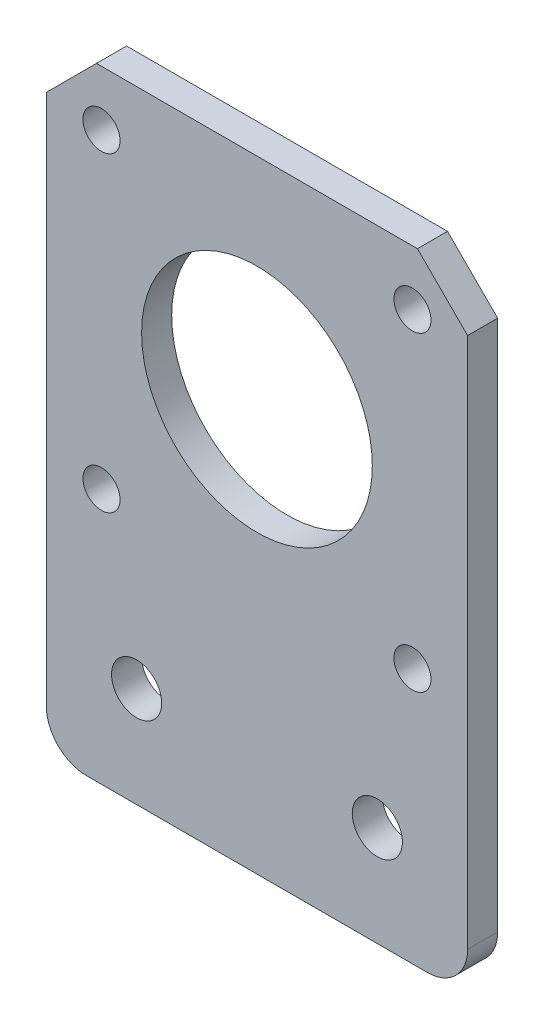
ISO-10303-21;
HEADER;
FILE_DESCRIPTION(('STEP AP214'),'2;1');
FILE_NAME('part.step','',(''),(''),'','','');
FILE_SCHEMA(('AUTOMOTIVE_DESIGN { 1 0 10303 214 1 1 1 1 }'));
ENDSEC;
DATA;
#1=APPLICATION_CONTEXT('core data for automotive mechanical design processes');
#2=APPLICATION_PROTOCOL_DEFINITION('international standard','automotive_design',2000,#1);
#3=PRODUCT_CONTEXT('',#1,'mechanical');
#4=PRODUCT('Part','Part','',(#3));
#5=PRODUCT_RELATED_PRODUCT_CATEGORY('part','',(#4));
#6=PRODUCT_DEFINITION_FORMATION('','',#4);
#7=PRODUCT_DEFINITION_CONTEXT('part definition',#1,'design');
#8=PRODUCT_DEFINITION('design','',#6,#7);
#9=PRODUCT_DEFINITION_SHAPE('','',#8);
#10=(LENGTH_UNIT() NAMED_UNIT(*) SI_UNIT(.MILLI.,.METRE.));
#11=(NAMED_UNIT(*) PLANE_ANGLE_UNIT() SI_UNIT($,.RADIAN.));
#12=(NAMED_UNIT(*) SI_UNIT($,.STERADIAN.) SOLID_ANGLE_UNIT());
#13=UNCERTAINTY_MEASURE_WITH_UNIT(LENGTH_MEASURE(1.E-05),#10,'distance_accuracy_value','');
#14=(GEOMETRIC_REPRESENTATION_CONTEXT(3) GLOBAL_UNCERTAINTY_ASSIGNED_CONTEXT((#13)) GLOBAL_UNIT_ASSIGNED_CONTEXT((#10,
#11,#12)) REPRESENTATION_CONTEXT('',''));
#15=CARTESIAN_POINT('',(0.,0.,0.));
#16=DIRECTION('',(0.,0.,1.));
#17=DIRECTION('',(1.,0.,0.));
#18=AXIS2_PLACEMENT_3D('',#15,#16,#17);
#19=CARTESIAN_POINT('',(0.,0.,3.));
#20=DIRECTION('',(0.,0.,1.));
#21=DIRECTION('',(1.,0.,0.));
#22=AXIS2_PLACEMENT_3D('',#19,#20,#21);
#23=PLANE('',#22);
#24=CARTESIAN_POINT('',(12.,-31.,3.));
#25=DIRECTION('',(0.,0.,1.));
#26=DIRECTION('',(-1.,0.,0.));
#27=AXIS2_PLACEMENT_3D('',#24,#25,#26);
#28=CIRCLE('',#27,2.5);
#29=CARTESIAN_POINT('',(9.49999999999999,-31.,3.));
#30=VERTEX_POINT('',#29);
#31=EDGE_CURVE('E288',#30,#30,#28,.T.);
#32=ORIENTED_EDGE('',*,*,#31,.F.);
#33=EDGE_LOOP('',(#32));
#34=FACE_BOUND('',#33,.T.);
#35=CARTESIAN_POINT('',(-15.5,-15.5,3.));
#36=DIRECTION('',(0.,0.,1.));
#37=DIRECTION('',(-1.,0.,0.));
#38=AXIS2_PLACEMENT_3D('',#35,#36,#37);
#39=CIRCLE('',#38,1.84974093264249);
#40=CARTESIAN_POINT('',(-17.3497409326425,-15.5,3.));
#41=VERTEX_POINT('',#40);
#42=EDGE_CURVE('E296',#41,#41,#39,.T.);
#43=ORIENTED_EDGE('',*,*,#42,.F.);
#44=EDGE_LOOP('',(#43));
#45=FACE_BOUND('',#44,.T.);
#46=CARTESIAN_POINT('',(15.5,15.5,3.));
#47=DIRECTION('',(0.,0.,1.));
#48=DIRECTION('',(-1.,0.,0.));
#49=AXIS2_PLACEMENT_3D('',#46,#47,#48);
#50=CIRCLE('',#49,1.84974093264249);
#51=CARTESIAN_POINT('',(13.6502590673575,15.5,3.));
#52=VERTEX_POINT('',#51);
#53=EDGE_CURVE('E234',#52,#52,#50,.T.);
#54=ORIENTED_EDGE('',*,*,#53,.F.);
#55=EDGE_LOOP('',(#54));
#56=FACE_BOUND('',#55,.T.);
#57=DIRECTION('',(0.,1.,0.));
#58=VECTOR('',#57,1.);
#59=CARTESIAN_POINT('',(21.,-21.,3.));
#60=LINE('',#59,#58);
#61=CARTESIAN_POINT('',(21.,-37.,3.));
#62=VERTEX_POINT('',#61);
#63=CARTESIAN_POINT('',(21.,16.,3.));
#64=VERTEX_POINT('',#63);
#65=EDGE_CURVE('E115',#62,#64,#60,.T.);
#66=ORIENTED_EDGE('',*,*,#65,.T.);
#67=DIRECTION('',(0.707106781186546,-0.707106781186549,0.));
#68=VECTOR('',#67,1.);
#69=CARTESIAN_POINT('',(18.5,18.5,3.));
#70=LINE('',#69,#68);
#71=CARTESIAN_POINT('',(16.,21.,3.));
#72=VERTEX_POINT('',#71);
#73=EDGE_CURVE('E40',#64,#72,#70,.F.);
#74=ORIENTED_EDGE('',*,*,#73,.T.);
#75=DIRECTION('',(-1.,0.,0.));
#76=VECTOR('',#75,1.);
#77=CARTESIAN_POINT('',(-21.,21.,3.));
#78=LINE('',#77,#76);
#79=CARTESIAN_POINT('',(-16.,21.,3.));
#80=VERTEX_POINT('',#79);
#81=EDGE_CURVE('E116',#72,#80,#78,.T.);
#82=ORIENTED_EDGE('',*,*,#81,.T.);
#83=DIRECTION('',(0.707106781186549,0.707106781186546,0.));
#84=VECTOR('',#83,1.);
#85=CARTESIAN_POINT('',(-18.4999999999999,18.5,3.));
#86=LINE('',#85,#84);
#87=CARTESIAN_POINT('',(-21.,16.,3.));
#88=VERTEX_POINT('',#87);
#89=EDGE_CURVE('E47',#80,#88,#86,.F.);
#90=ORIENTED_EDGE('',*,*,#89,.T.);
#91=DIRECTION('',(0.,-1.,0.));
#92=VECTOR('',#91,1.);
#93=CARTESIAN_POINT('',(-21.,21.,3.));
#94=LINE('',#93,#92);
#95=CARTESIAN_POINT('',(-21.,-37.,3.));
#96=VERTEX_POINT('',#95);
#97=EDGE_CURVE('E126',#88,#96,#94,.T.);
#98=ORIENTED_EDGE('',*,*,#97,.T.);
#99=CARTESIAN_POINT('',(-17.,-37.,3.));
#100=DIRECTION('',(0.,0.,1.));
#101=DIRECTION('',(1.,0.,0.));
#102=AXIS2_PLACEMENT_3D('',#99,#100,#101);
#103=CIRCLE('',#102,4.);
#104=CARTESIAN_POINT('',(-17.,-41.,3.));
#105=VERTEX_POINT('',#104);
#106=EDGE_CURVE('E137',#96,#105,#103,.T.);
#107=ORIENTED_EDGE('',*,*,#106,.T.);
#108=DIRECTION('',(1.,0.,0.));
#109=VECTOR('',#108,1.);
#110=CARTESIAN_POINT('',(-21.,-41.,3.));
#111=LINE('',#110,#109);
#112=CARTESIAN_POINT('',(17.,-41.,3.));
#113=VERTEX_POINT('',#112);
#114=EDGE_CURVE('E254',#105,#113,#111,.T.);
#115=ORIENTED_EDGE('',*,*,#114,.T.);
#116=CARTESIAN_POINT('',(17.,-37.,3.));
#117=DIRECTION('',(0.,0.,1.));
#118=DIRECTION('',(1.,0.,0.));
#119=AXIS2_PLACEMENT_3D('',#116,#117,#118);
#120=CIRCLE('',#119,4.);
#121=EDGE_CURVE('E139',#113,#62,#120,.T.);
#122=ORIENTED_EDGE('',*,*,#121,.T.);
#123=EDGE_LOOP('',(#66,#74,#82,#90,#98,#107,#115,#122));
#124=FACE_BOUND('',#123,.T.);
#125=CARTESIAN_POINT('',(-15.5,15.5,3.));
#126=DIRECTION('',(0.,0.,1.));
#127=DIRECTION('',(1.,0.,0.));
#128=AXIS2_PLACEMENT_3D('',#125,#126,#127);
#129=CIRCLE('',#128,1.84974093264249);
#130=CARTESIAN_POINT('',(-13.6502590673575,15.5,3.));
#131=VERTEX_POINT('',#130);
#132=EDGE_CURVE('E248',#131,#131,#129,.T.);
#133=ORIENTED_EDGE('',*,*,#132,.F.);
#134=EDGE_LOOP('',(#133));
#135=FACE_BOUND('',#134,.T.);
#136=CARTESIAN_POINT('',(15.5,-15.5,3.));
#137=DIRECTION('',(0.,0.,1.));
#138=DIRECTION('',(1.,0.,0.));
#139=AXIS2_PLACEMENT_3D('',#136,#137,#138);
#140=CIRCLE('',#139,1.84974093264249);
#141=CARTESIAN_POINT('',(17.3497409326424,-15.5,3.));
#142=VERTEX_POINT('',#141);
#143=EDGE_CURVE('E239',#142,#142,#140,.T.);
#144=ORIENTED_EDGE('',*,*,#143,.F.);
#145=EDGE_LOOP('',(#144));
#146=FACE_BOUND('',#145,.T.);
#147=CARTESIAN_POINT('',(-12.,-31.,3.));
#148=DIRECTION('',(0.,0.,1.));
#149=DIRECTION('',(1.,0.,0.));
#150=AXIS2_PLACEMENT_3D('',#147,#148,#149);
#151=CIRCLE('',#150,2.5);
#152=CARTESIAN_POINT('',(-9.49999999999999,-31.,3.));
#153=VERTEX_POINT('',#152);
#154=EDGE_CURVE('E292',#153,#153,#151,.T.);
#155=ORIENTED_EDGE('',*,*,#154,.F.);
#156=EDGE_LOOP('',(#155));
#157=FACE_BOUND('',#156,.T.);
#158=CARTESIAN_POINT('',(0.,0.,3.));
#159=DIRECTION('',(0.,0.,1.));
#160=DIRECTION('',(1.,0.,0.));
#161=AXIS2_PLACEMENT_3D('',#158,#159,#160);
#162=CIRCLE('',#161,11.5);
#163=CARTESIAN_POINT('',(11.5,0.,3.));
#164=VERTEX_POINT('',#163);
#165=EDGE_CURVE('E284',#164,#164,#162,.T.);
#166=ORIENTED_EDGE('',*,*,#165,.F.);
#167=EDGE_LOOP('',(#166));
#168=FACE_BOUND('',#167,.T.);
#169=ADVANCED_FACE('F32',(#34,#45,#56,#124,#135,#146,#157,#168),#23,.T.);
#170=CARTESIAN_POINT('',(0.,0.,0.));
#171=DIRECTION('',(0.,0.,1.));
#172=DIRECTION('',(1.,0.,0.));
#173=AXIS2_PLACEMENT_3D('',#170,#171,#172);
#174=PLANE('',#173);
#175=DIRECTION('',(-1.,0.,0.));
#176=VECTOR('',#175,1.);
#177=CARTESIAN_POINT('',(-21.,21.,0.));
#178=LINE('',#177,#176);
#179=CARTESIAN_POINT('',(16.,21.,0.));
#180=VERTEX_POINT('',#179);
#181=CARTESIAN_POINT('',(-16.,21.,0.));
#182=VERTEX_POINT('',#181);
#183=EDGE_CURVE('E122',#180,#182,#178,.T.);
#184=ORIENTED_EDGE('',*,*,#183,.F.);
#185=DIRECTION('',(-0.707106781186546,0.707106781186549,0.));
#186=VECTOR('',#185,1.);
#187=CARTESIAN_POINT('',(16.,21.,0.));
#188=LINE('',#187,#186);
#189=CARTESIAN_POINT('',(21.,16.,0.));
#190=VERTEX_POINT('',#189);
#191=EDGE_CURVE('E121',#180,#190,#188,.F.);
#192=ORIENTED_EDGE('',*,*,#191,.T.);
#193=DIRECTION('',(0.,1.,0.));
#194=VECTOR('',#193,1.);
#195=CARTESIAN_POINT('',(21.,21.,0.));
#196=LINE('',#195,#194);
#197=CARTESIAN_POINT('',(21.,-37.,0.));
#198=VERTEX_POINT('',#197);
#199=EDGE_CURVE('E114',#198,#190,#196,.T.);
#200=ORIENTED_EDGE('',*,*,#199,.F.);
#201=CARTESIAN_POINT('',(17.,-37.,0.));
#202=DIRECTION('',(0.,0.,1.));
#203=DIRECTION('',(1.,0.,0.));
#204=AXIS2_PLACEMENT_3D('',#201,#202,#203);
#205=CIRCLE('',#204,4.);
#206=CARTESIAN_POINT('',(17.,-41.,0.));
#207=VERTEX_POINT('',#206);
#208=EDGE_CURVE('E100',#198,#207,#205,.F.);
#209=ORIENTED_EDGE('',*,*,#208,.T.);
#210=DIRECTION('',(1.,0.,0.));
#211=VECTOR('',#210,1.);
#212=CARTESIAN_POINT('',(-21.,-41.,0.));
#213=LINE('',#212,#211);
#214=CARTESIAN_POINT('',(-17.,-41.,0.));
#215=VERTEX_POINT('',#214);
#216=EDGE_CURVE('E123',#215,#207,#213,.T.);
#217=ORIENTED_EDGE('',*,*,#216,.F.);
#218=CARTESIAN_POINT('',(-17.,-37.,0.));
#219=DIRECTION('',(0.,0.,1.));
#220=DIRECTION('',(1.,0.,0.));
#221=AXIS2_PLACEMENT_3D('',#218,#219,#220);
#222=CIRCLE('',#221,4.);
#223=CARTESIAN_POINT('',(-21.,-37.,0.));
#224=VERTEX_POINT('',#223);
#225=EDGE_CURVE('E111',#215,#224,#222,.F.);
#226=ORIENTED_EDGE('',*,*,#225,.T.);
#227=DIRECTION('',(0.,-1.,0.));
#228=VECTOR('',#227,1.);
#229=CARTESIAN_POINT('',(-21.,-21.,0.));
#230=LINE('',#229,#228);
#231=CARTESIAN_POINT('',(-21.,16.,0.));
#232=VERTEX_POINT('',#231);
#233=EDGE_CURVE('E128',#232,#224,#230,.T.);
#234=ORIENTED_EDGE('',*,*,#233,.F.);
#235=DIRECTION('',(-0.707106781186549,-0.707106781186546,0.));
#236=VECTOR('',#235,1.);
#237=CARTESIAN_POINT('',(-21.,16.,0.));
#238=LINE('',#237,#236);
#239=EDGE_CURVE('E149',#232,#182,#238,.F.);
#240=ORIENTED_EDGE('',*,*,#239,.T.);
#241=EDGE_LOOP('',(#184,#192,#200,#209,#217,#226,#234,#240));
#242=FACE_BOUND('',#241,.T.);
#243=CARTESIAN_POINT('',(-15.5,15.5,0.));
#244=DIRECTION('',(0.,0.,1.));
#245=DIRECTION('',(1.,0.,0.));
#246=AXIS2_PLACEMENT_3D('',#243,#244,#245);
#247=CIRCLE('',#246,1.84974093264249);
#248=CARTESIAN_POINT('',(-13.6502590673575,15.5,0.));
#249=VERTEX_POINT('',#248);
#250=EDGE_CURVE('E241',#249,#249,#247,.T.);
#251=ORIENTED_EDGE('',*,*,#250,.T.);
#252=EDGE_LOOP('',(#251));
#253=FACE_BOUND('',#252,.T.);
#254=CARTESIAN_POINT('',(15.5,15.5,0.));
#255=DIRECTION('',(0.,0.,1.));
#256=DIRECTION('',(-1.,0.,0.));
#257=AXIS2_PLACEMENT_3D('',#254,#255,#256);
#258=CIRCLE('',#257,1.84974093264249);
#259=CARTESIAN_POINT('',(13.6502590673575,15.5,0.));
#260=VERTEX_POINT('',#259);
#261=EDGE_CURVE('E237',#260,#260,#258,.T.);
#262=ORIENTED_EDGE('',*,*,#261,.T.);
#263=EDGE_LOOP('',(#262));
#264=FACE_BOUND('',#263,.T.);
#265=CARTESIAN_POINT('',(15.5,-15.5,0.));
#266=DIRECTION('',(0.,0.,1.));
#267=DIRECTION('',(1.,0.,0.));
#268=AXIS2_PLACEMENT_3D('',#265,#266,#267);
#269=CIRCLE('',#268,1.84974093264249);
#270=CARTESIAN_POINT('',(17.3497409326424,-15.5,0.));
#271=VERTEX_POINT('',#270);
#272=EDGE_CURVE('E244',#271,#271,#269,.T.);
#273=ORIENTED_EDGE('',*,*,#272,.T.);
#274=EDGE_LOOP('',(#273));
#275=FACE_BOUND('',#274,.T.);
#276=CARTESIAN_POINT('',(-15.5,-15.5,0.));
#277=DIRECTION('',(0.,0.,1.));
#278=DIRECTION('',(-1.,0.,0.));
#279=AXIS2_PLACEMENT_3D('',#276,#277,#278);
#280=CIRCLE('',#279,1.84974093264249);
#281=CARTESIAN_POINT('',(-17.3497409326425,-15.5,0.));
#282=VERTEX_POINT('',#281);
#283=EDGE_CURVE('E272',#282,#282,#280,.T.);
#284=ORIENTED_EDGE('',*,*,#283,.T.);
#285=EDGE_LOOP('',(#284));
#286=FACE_BOUND('',#285,.T.);
#287=CARTESIAN_POINT('',(-12.,-31.,0.));
#288=DIRECTION('',(0.,0.,1.));
#289=DIRECTION('',(1.,0.,0.));
#290=AXIS2_PLACEMENT_3D('',#287,#288,#289);
#291=CIRCLE('',#290,2.5);
#292=CARTESIAN_POINT('',(-9.49999999999999,-31.,0.));
#293=VERTEX_POINT('',#292);
#294=EDGE_CURVE('E276',#293,#293,#291,.T.);
#295=ORIENTED_EDGE('',*,*,#294,.T.);
#296=EDGE_LOOP('',(#295));
#297=FACE_BOUND('',#296,.T.);
#298=CARTESIAN_POINT('',(12.,-31.,0.));
#299=DIRECTION('',(0.,0.,1.));
#300=DIRECTION('',(-1.,0.,0.));
#301=AXIS2_PLACEMENT_3D('',#298,#299,#300);
#302=CIRCLE('',#301,2.5);
#303=CARTESIAN_POINT('',(9.49999999999999,-31.,0.));
#304=VERTEX_POINT('',#303);
#305=EDGE_CURVE('E280',#304,#304,#302,.T.);
#306=ORIENTED_EDGE('',*,*,#305,.T.);
#307=EDGE_LOOP('',(#306));
#308=FACE_BOUND('',#307,.T.);
#309=CARTESIAN_POINT('',(0.,0.,0.));
#310=DIRECTION('',(0.,0.,1.));
#311=DIRECTION('',(1.,0.,0.));
#312=AXIS2_PLACEMENT_3D('',#309,#310,#311);
#313=CIRCLE('',#312,11.5);
#314=CARTESIAN_POINT('',(11.5,0.,0.));
#315=VERTEX_POINT('',#314);
#316=EDGE_CURVE('E283',#315,#315,#313,.T.);
#317=ORIENTED_EDGE('',*,*,#316,.T.);
#318=EDGE_LOOP('',(#317));
#319=FACE_BOUND('',#318,.T.);
#320=ADVANCED_FACE('F119',(#242,#253,#264,#275,#286,#297,#308,#319),#174,.F.);
#321=CARTESIAN_POINT('',(-21.,-21.,3.));
#322=DIRECTION('',(1.,0.,0.));
#323=DIRECTION('',(0.,1.,0.));
#324=AXIS2_PLACEMENT_3D('',#321,#322,#323);
#325=PLANE('',#324);
#326=ORIENTED_EDGE('',*,*,#97,.F.);
#327=DIRECTION('',(0.,0.,-1.));
#328=VECTOR('',#327,1.);
#329=CARTESIAN_POINT('',(-21.,16.,3.));
#330=LINE('',#329,#328);
#331=EDGE_CURVE('E11',#88,#232,#330,.T.);
#332=ORIENTED_EDGE('',*,*,#331,.T.);
#333=ORIENTED_EDGE('',*,*,#233,.T.);
#334=DIRECTION('',(0.,0.,-1.));
#335=VECTOR('',#334,1.);
#336=CARTESIAN_POINT('',(-21.,-37.,3.));
#337=LINE('',#336,#335);
#338=EDGE_CURVE('E141',#224,#96,#337,.F.);
#339=ORIENTED_EDGE('',*,*,#338,.T.);
#340=EDGE_LOOP('',(#326,#332,#333,#339));
#341=FACE_BOUND('',#340,.T.);
#342=ADVANCED_FACE('F178',(#341),#325,.F.);
#343=CARTESIAN_POINT('',(-21.,-41.,3.));
#344=DIRECTION('',(0.,1.,0.));
#345=DIRECTION('',(0.,0.,1.));
#346=AXIS2_PLACEMENT_3D('',#343,#344,#345);
#347=PLANE('',#346);
#348=ORIENTED_EDGE('',*,*,#216,.T.);
#349=DIRECTION('',(0.,0.,-1.));
#350=VECTOR('',#349,1.);
#351=CARTESIAN_POINT('',(17.,-41.,3.));
#352=LINE('',#351,#350);
#353=EDGE_CURVE('E105',#207,#113,#352,.F.);
#354=ORIENTED_EDGE('',*,*,#353,.T.);
#355=ORIENTED_EDGE('',*,*,#114,.F.);
#356=DIRECTION('',(0.,0.,-1.));
#357=VECTOR('',#356,1.);
#358=CARTESIAN_POINT('',(-17.,-41.,3.));
#359=LINE('',#358,#357);
#360=EDGE_CURVE('E110',#105,#215,#359,.T.);
#361=ORIENTED_EDGE('',*,*,#360,.T.);
#362=EDGE_LOOP('',(#348,#354,#355,#361));
#363=FACE_BOUND('',#362,.T.);
#364=ADVANCED_FACE('F190',(#363),#347,.F.);
#365=CARTESIAN_POINT('',(21.,21.,3.));
#366=DIRECTION('',(-1.,0.,0.));
#367=DIRECTION('',(0.,-1.,0.));
#368=AXIS2_PLACEMENT_3D('',#365,#366,#367);
#369=PLANE('',#368);
#370=ORIENTED_EDGE('',*,*,#199,.T.);
#371=DIRECTION('',(0.,0.,1.));
#372=VECTOR('',#371,1.);
#373=CARTESIAN_POINT('',(21.,16.,3.));
#374=LINE('',#373,#372);
#375=EDGE_CURVE('E55',#190,#64,#374,.T.);
#376=ORIENTED_EDGE('',*,*,#375,.T.);
#377=ORIENTED_EDGE('',*,*,#65,.F.);
#378=DIRECTION('',(0.,0.,-1.));
#379=VECTOR('',#378,1.);
#380=CARTESIAN_POINT('',(21.,-37.,3.));
#381=LINE('',#380,#379);
#382=EDGE_CURVE('E104',#62,#198,#381,.T.);
#383=ORIENTED_EDGE('',*,*,#382,.T.);
#384=EDGE_LOOP('',(#370,#376,#377,#383));
#385=FACE_BOUND('',#384,.T.);
#386=ADVANCED_FACE('F113',(#385),#369,.F.);
#387=CARTESIAN_POINT('',(-21.,21.,3.));
#388=DIRECTION('',(0.,-1.,0.));
#389=DIRECTION('',(0.,0.,-1.));
#390=AXIS2_PLACEMENT_3D('',#387,#388,#389);
#391=PLANE('',#390);
#392=ORIENTED_EDGE('',*,*,#81,.F.);
#393=DIRECTION('',(0.,0.,-1.));
#394=VECTOR('',#393,1.);
#395=CARTESIAN_POINT('',(16.,21.,3.));
#396=LINE('',#395,#394);
#397=EDGE_CURVE('E146',#72,#180,#396,.T.);
#398=ORIENTED_EDGE('',*,*,#397,.T.);
#399=ORIENTED_EDGE('',*,*,#183,.T.);
#400=DIRECTION('',(0.,0.,1.));
#401=VECTOR('',#400,1.);
#402=CARTESIAN_POINT('',(-16.,21.,3.));
#403=LINE('',#402,#401);
#404=EDGE_CURVE('E144',#182,#80,#403,.T.);
#405=ORIENTED_EDGE('',*,*,#404,.T.);
#406=EDGE_LOOP('',(#392,#398,#399,#405));
#407=FACE_BOUND('',#406,.T.);
#408=ADVANCED_FACE('F159',(#407),#391,.F.);
#409=CARTESIAN_POINT('',(-15.5,15.5,3.));
#410=DIRECTION('',(0.,0.,-1.));
#411=DIRECTION('',(-1.,0.,0.));
#412=AXIS2_PLACEMENT_3D('',#409,#410,#411);
#413=CYLINDRICAL_SURFACE('',#412,1.84974093264249);
#414=ORIENTED_EDGE('',*,*,#132,.T.);
#415=EDGE_LOOP('',(#414));
#416=FACE_BOUND('',#415,.T.);
#417=ORIENTED_EDGE('',*,*,#250,.F.);
#418=EDGE_LOOP('',(#417));
#419=FACE_BOUND('',#418,.T.);
#420=ADVANCED_FACE('F183',(#416,#419),#413,.F.);
#421=CARTESIAN_POINT('',(15.5,15.5,3.));
#422=DIRECTION('',(0.,0.,-1.));
#423=DIRECTION('',(-1.,0.,0.));
#424=AXIS2_PLACEMENT_3D('',#421,#422,#423);
#425=CYLINDRICAL_SURFACE('',#424,1.84974093264249);
#426=ORIENTED_EDGE('',*,*,#53,.T.);
#427=EDGE_LOOP('',(#426));
#428=FACE_BOUND('',#427,.T.);
#429=ORIENTED_EDGE('',*,*,#261,.F.);
#430=EDGE_LOOP('',(#429));
#431=FACE_BOUND('',#430,.T.);
#432=ADVANCED_FACE('F223',(#428,#431),#425,.F.);
#433=CARTESIAN_POINT('',(15.5,-15.5,3.));
#434=DIRECTION('',(0.,0.,-1.));
#435=DIRECTION('',(-1.,0.,0.));
#436=AXIS2_PLACEMENT_3D('',#433,#434,#435);
#437=CYLINDRICAL_SURFACE('',#436,1.84974093264249);
#438=ORIENTED_EDGE('',*,*,#143,.T.);
#439=EDGE_LOOP('',(#438));
#440=FACE_BOUND('',#439,.T.);
#441=ORIENTED_EDGE('',*,*,#272,.F.);
#442=EDGE_LOOP('',(#441));
#443=FACE_BOUND('',#442,.T.);
#444=ADVANCED_FACE('F220',(#440,#443),#437,.F.);
#445=CARTESIAN_POINT('',(-15.5,-15.5,3.));
#446=DIRECTION('',(0.,0.,-1.));
#447=DIRECTION('',(-1.,0.,0.));
#448=AXIS2_PLACEMENT_3D('',#445,#446,#447);
#449=CYLINDRICAL_SURFACE('',#448,1.84974093264249);
#450=ORIENTED_EDGE('',*,*,#42,.T.);
#451=EDGE_LOOP('',(#450));
#452=FACE_BOUND('',#451,.T.);
#453=ORIENTED_EDGE('',*,*,#283,.F.);
#454=EDGE_LOOP('',(#453));
#455=FACE_BOUND('',#454,.T.);
#456=ADVANCED_FACE('F216',(#452,#455),#449,.F.);
#457=CARTESIAN_POINT('',(-12.,-31.,3.));
#458=DIRECTION('',(0.,0.,-1.));
#459=DIRECTION('',(-1.,0.,0.));
#460=AXIS2_PLACEMENT_3D('',#457,#458,#459);
#461=CYLINDRICAL_SURFACE('',#460,2.5);
#462=ORIENTED_EDGE('',*,*,#154,.T.);
#463=EDGE_LOOP('',(#462));
#464=FACE_BOUND('',#463,.T.);
#465=ORIENTED_EDGE('',*,*,#294,.F.);
#466=EDGE_LOOP('',(#465));
#467=FACE_BOUND('',#466,.T.);
#468=ADVANCED_FACE('F208',(#464,#467),#461,.F.);
#469=CARTESIAN_POINT('',(12.,-31.,3.));
#470=DIRECTION('',(0.,0.,-1.));
#471=DIRECTION('',(-1.,0.,0.));
#472=AXIS2_PLACEMENT_3D('',#469,#470,#471);
#473=CYLINDRICAL_SURFACE('',#472,2.5);
#474=ORIENTED_EDGE('',*,*,#31,.T.);
#475=EDGE_LOOP('',(#474));
#476=FACE_BOUND('',#475,.T.);
#477=ORIENTED_EDGE('',*,*,#305,.F.);
#478=EDGE_LOOP('',(#477));
#479=FACE_BOUND('',#478,.T.);
#480=ADVANCED_FACE('F202',(#476,#479),#473,.F.);
#481=CARTESIAN_POINT('',(0.,0.,3.));
#482=DIRECTION('',(0.,0.,-1.));
#483=DIRECTION('',(-1.,0.,0.));
#484=AXIS2_PLACEMENT_3D('',#481,#482,#483);
#485=CYLINDRICAL_SURFACE('',#484,11.5);
#486=ORIENTED_EDGE('',*,*,#165,.T.);
#487=EDGE_LOOP('',(#486));
#488=FACE_BOUND('',#487,.T.);
#489=ORIENTED_EDGE('',*,*,#316,.F.);
#490=EDGE_LOOP('',(#489));
#491=FACE_BOUND('',#490,.T.);
#492=ADVANCED_FACE('F198',(#488,#491),#485,.F.);
#493=CARTESIAN_POINT('',(17.,-37.,3.));
#494=DIRECTION('',(0.,0.,-1.));
#495=DIRECTION('',(-1.,0.,0.));
#496=AXIS2_PLACEMENT_3D('',#493,#494,#495);
#497=CYLINDRICAL_SURFACE('',#496,4.);
#498=ORIENTED_EDGE('',*,*,#121,.F.);
#499=ORIENTED_EDGE('',*,*,#353,.F.);
#500=ORIENTED_EDGE('',*,*,#208,.F.);
#501=ORIENTED_EDGE('',*,*,#382,.F.);
#502=EDGE_LOOP('',(#498,#499,#500,#501));
#503=FACE_BOUND('',#502,.T.);
#504=ADVANCED_FACE('F103',(#503),#497,.T.);
#505=CARTESIAN_POINT('',(-17.,-37.,3.));
#506=DIRECTION('',(0.,0.,-1.));
#507=DIRECTION('',(-1.,0.,0.));
#508=AXIS2_PLACEMENT_3D('',#505,#506,#507);
#509=CYLINDRICAL_SURFACE('',#508,4.);
#510=ORIENTED_EDGE('',*,*,#106,.F.);
#511=ORIENTED_EDGE('',*,*,#338,.F.);
#512=ORIENTED_EDGE('',*,*,#225,.F.);
#513=ORIENTED_EDGE('',*,*,#360,.F.);
#514=EDGE_LOOP('',(#510,#511,#512,#513));
#515=FACE_BOUND('',#514,.T.);
#516=ADVANCED_FACE('F164',(#515),#509,.T.);
#517=CARTESIAN_POINT('',(16.,21.,3.));
#518=DIRECTION('',(-0.707106781186549,-0.707106781186546,0.));
#519=DIRECTION('',(0.,0.,-1.));
#520=AXIS2_PLACEMENT_3D('',#517,#518,#519);
#521=PLANE('',#520);
#522=ORIENTED_EDGE('',*,*,#73,.F.);
#523=ORIENTED_EDGE('',*,*,#375,.F.);
#524=ORIENTED_EDGE('',*,*,#191,.F.);
#525=ORIENTED_EDGE('',*,*,#397,.F.);
#526=EDGE_LOOP('',(#522,#523,#524,#525));
#527=FACE_BOUND('',#526,.T.);
#528=ADVANCED_FACE('F162',(#527),#521,.F.);
#529=CARTESIAN_POINT('',(-21.,16.,3.));
#530=DIRECTION('',(0.707106781186546,-0.707106781186549,0.));
#531=DIRECTION('',(0.,0.,-1.));
#532=AXIS2_PLACEMENT_3D('',#529,#530,#531);
#533=PLANE('',#532);
#534=ORIENTED_EDGE('',*,*,#89,.F.);
#535=ORIENTED_EDGE('',*,*,#404,.F.);
#536=ORIENTED_EDGE('',*,*,#239,.F.);
#537=ORIENTED_EDGE('',*,*,#331,.F.);
#538=EDGE_LOOP('',(#534,#535,#536,#537));
#539=FACE_BOUND('',#538,.T.);
#540=ADVANCED_FACE('F34',(#539),#533,.F.);
#541=CLOSED_SHELL('',(#169,#320,#342,#364,#386,#408,#420,#432,#444,#456,#468,#480,#492,#504,
#516,#528,#540));
#542=MANIFOLD_SOLID_BREP('B2',#541);
#543=ADVANCED_BREP_SHAPE_REPRESENTATION('',(#18,#542),#14);
#544=SHAPE_DEFINITION_REPRESENTATION(#9,#543);
ENDSEC;
END-ISO-10303-21;
